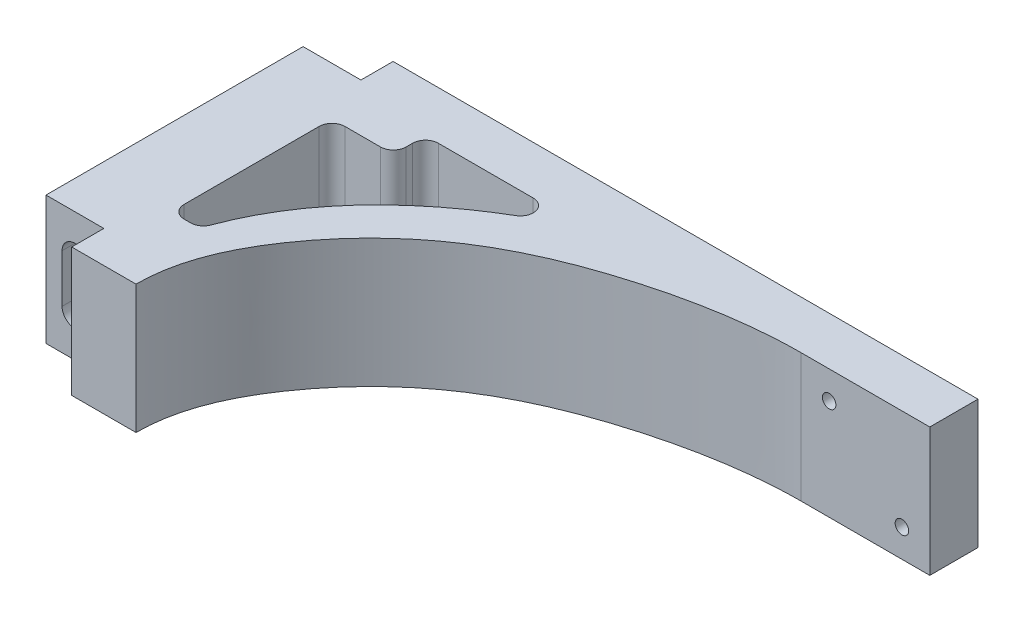
ISO-10303-21;
HEADER;
FILE_DESCRIPTION(('STEP AP214'),'2;1');
FILE_NAME('part.step','',(''),(''),'','','');
FILE_SCHEMA(('AUTOMOTIVE_DESIGN { 1 0 10303 214 1 1 1 1 }'));
ENDSEC;
DATA;
#1=APPLICATION_CONTEXT('core data for automotive mechanical design processes');
#2=APPLICATION_PROTOCOL_DEFINITION('international standard','automotive_design',2000,#1);
#3=PRODUCT_CONTEXT('',#1,'mechanical');
#4=PRODUCT('Part','Part','',(#3));
#5=PRODUCT_RELATED_PRODUCT_CATEGORY('part','',(#4));
#6=PRODUCT_DEFINITION_FORMATION('','',#4);
#7=PRODUCT_DEFINITION_CONTEXT('part definition',#1,'design');
#8=PRODUCT_DEFINITION('design','',#6,#7);
#9=PRODUCT_DEFINITION_SHAPE('','',#8);
#10=(LENGTH_UNIT() NAMED_UNIT(*) SI_UNIT(.MILLI.,.METRE.));
#11=(NAMED_UNIT(*) PLANE_ANGLE_UNIT() SI_UNIT($,.RADIAN.));
#12=(NAMED_UNIT(*) SI_UNIT($,.STERADIAN.) SOLID_ANGLE_UNIT());
#13=UNCERTAINTY_MEASURE_WITH_UNIT(LENGTH_MEASURE(1.E-05),#10,'distance_accuracy_value','');
#14=(GEOMETRIC_REPRESENTATION_CONTEXT(3) GLOBAL_UNCERTAINTY_ASSIGNED_CONTEXT((#13)) GLOBAL_UNIT_ASSIGNED_CONTEXT((#10,
#11,#12)) REPRESENTATION_CONTEXT('',''));
#15=CARTESIAN_POINT('',(0.,0.,0.));
#16=DIRECTION('',(0.,0.,1.));
#17=DIRECTION('',(1.,0.,0.));
#18=AXIS2_PLACEMENT_3D('',#15,#16,#17);
#19=CARTESIAN_POINT('',(12.5070357976708,20.,11.9830251142711));
#20=DIRECTION('',(0.,-1.,0.));
#21=DIRECTION('',(0.,0.,-1.));
#22=AXIS2_PLACEMENT_3D('',#19,#20,#21);
#23=PLANE('',#22);
#24=DIRECTION('',(-1.,0.,0.));
#25=VECTOR('',#24,1.);
#26=CARTESIAN_POINT('',(-28.6582563370952,20.,-0.746179815089038));
#27=LINE('',#26,#25);
#28=CARTESIAN_POINT('',(-19.6582563370952,20.,-0.746179815089023));
#29=VERTEX_POINT('',#28);
#30=CARTESIAN_POINT('',(-28.6582563370952,20.,-0.746179815089038));
#31=VERTEX_POINT('',#30);
#32=EDGE_CURVE('E349',#29,#31,#27,.T.);
#33=ORIENTED_EDGE('',*,*,#32,.T.);
#34=DIRECTION('',(0.,0.,1.));
#35=VECTOR('',#34,1.);
#36=CARTESIAN_POINT('',(-28.6582563370952,20.,-0.746179815089038));
#37=LINE('',#36,#35);
#38=CARTESIAN_POINT('',(-28.6582563370952,20.,39.253820184911));
#39=VERTEX_POINT('',#38);
#40=EDGE_CURVE('E395',#31,#39,#37,.T.);
#41=ORIENTED_EDGE('',*,*,#40,.T.);
#42=DIRECTION('',(1.,0.,0.));
#43=VECTOR('',#42,1.);
#44=CARTESIAN_POINT('',(-19.6582563370952,20.,39.253820184911));
#45=LINE('',#44,#43);
#46=CARTESIAN_POINT('',(-19.6582563370952,20.,39.253820184911));
#47=VERTEX_POINT('',#46);
#48=EDGE_CURVE('E379',#39,#47,#45,.T.);
#49=ORIENTED_EDGE('',*,*,#48,.T.);
#50=DIRECTION('',(0.,0.,1.));
#51=VECTOR('',#50,1.);
#52=CARTESIAN_POINT('',(-19.6582563370952,20.,44.253820184911));
#53=LINE('',#52,#51);
#54=CARTESIAN_POINT('',(-19.6582563370952,20.,44.253820184911));
#55=VERTEX_POINT('',#54);
#56=EDGE_CURVE('E394',#47,#55,#53,.T.);
#57=ORIENTED_EDGE('',*,*,#56,.T.);
#58=DIRECTION('',(1.,0.,0.));
#59=VECTOR('',#58,1.);
#60=CARTESIAN_POINT('',(-9.65825633709522,20.,44.253820184911));
#61=LINE('',#60,#59);
#62=CARTESIAN_POINT('',(-9.65825633709522,20.,44.253820184911));
#63=VERTEX_POINT('',#62);
#64=EDGE_CURVE('E309',#55,#63,#61,.T.);
#65=ORIENTED_EDGE('',*,*,#64,.T.);
#66=CARTESIAN_POINT('',(-9.65825633709522,20.,44.253820184911));
#67=CARTESIAN_POINT('',(-9.65825633709522,20.,37.8885028795573));
#68=CARTESIAN_POINT('',(-4.67583753182754,20.,26.6259134312278));
#69=CARTESIAN_POINT('',(9.29440035030482,20.,12.3276626777217));
#70=CARTESIAN_POINT('',(29.0667731762332,20.,4.28590793809066));
#71=CARTESIAN_POINT('',(43.9502207597576,20.,1.75382018491096));
#72=CARTESIAN_POINT('',(51.3417436629048,20.,1.75382018491096));
#73=B_SPLINE_CURVE_WITH_KNOTS('',3,(#66,#67,#68,#69,#70,#71,#72),.UNSPECIFIED.,.F.,.F.,(4,1,1,1,
4),(0.,0.219347647330992,0.451050169434159,0.721712385749768,1.),.UNSPECIFIED.);
#74=CARTESIAN_POINT('',(51.3417436629048,20.,1.75382018491096));
#75=VERTEX_POINT('',#74);
#76=EDGE_CURVE('E302',#63,#75,#73,.T.);
#77=ORIENTED_EDGE('',*,*,#76,.T.);
#78=DIRECTION('',(1.,0.,0.));
#79=VECTOR('',#78,1.);
#80=CARTESIAN_POINT('',(71.3417436629048,20.,1.75382018491096));
#81=LINE('',#80,#79);
#82=CARTESIAN_POINT('',(71.3417436629048,20.,1.75382018491096));
#83=VERTEX_POINT('',#82);
#84=EDGE_CURVE('E308',#75,#83,#81,.T.);
#85=ORIENTED_EDGE('',*,*,#84,.T.);
#86=DIRECTION('',(0.,0.,-1.));
#87=VECTOR('',#86,1.);
#88=CARTESIAN_POINT('',(71.3417436629048,20.,-5.74617981508904));
#89=LINE('',#88,#87);
#90=CARTESIAN_POINT('',(71.3417436629048,20.,-5.74617981508904));
#91=VERTEX_POINT('',#90);
#92=EDGE_CURVE('E315',#83,#91,#89,.T.);
#93=ORIENTED_EDGE('',*,*,#92,.T.);
#94=DIRECTION('',(-1.,0.,0.));
#95=VECTOR('',#94,1.);
#96=CARTESIAN_POINT('',(-19.6582563370952,20.,-5.74617981508902));
#97=LINE('',#96,#95);
#98=CARTESIAN_POINT('',(-19.6582563370952,20.,-5.74617981508902));
#99=VERTEX_POINT('',#98);
#100=EDGE_CURVE('E317',#91,#99,#97,.T.);
#101=ORIENTED_EDGE('',*,*,#100,.T.);
#102=DIRECTION('',(0.,0.,1.));
#103=VECTOR('',#102,1.);
#104=CARTESIAN_POINT('',(-19.6582563370952,20.,-0.746179815089023));
#105=LINE('',#104,#103);
#106=EDGE_CURVE('E319',#99,#29,#105,.T.);
#107=ORIENTED_EDGE('',*,*,#106,.T.);
#108=EDGE_LOOP('',(#33,#41,#49,#57,#65,#77,#85,#93,#101,#107));
#109=FACE_BOUND('',#108,.T.);
#110=CARTESIAN_POINT('',(-11.7837759860421,20.,30.451189107014));
#111=CARTESIAN_POINT('',(-11.2741851571584,20.,29.081443531117));
#112=CARTESIAN_POINT('',(-9.92430631581834,20.,25.9698878584016));
#113=CARTESIAN_POINT('',(-6.25265363904169,20.,19.752734333027));
#114=CARTESIAN_POINT('',(0.00114873176237278,20.,12.8231388491368));
#115=CARTESIAN_POINT('',(6.36706889389602,20.,8.07935758013021));
#116=CARTESIAN_POINT('',(10.0086539193125,20.,5.8603208288681));
#117=CARTESIAN_POINT('',(10.6588904455348,20.,5.47871409912117));
#118=B_SPLINE_CURVE_WITH_KNOTS('',3,(#110,#111,#112,#113,#114,#115,#116,#117),.UNSPECIFIED.,.F.,
.F.,(4,1,1,1,1,4),(0.457049826038681,0.498595933595701,0.553238181024709,0.662522675882725,
0.771807170740741,0.795346530072272),.UNSPECIFIED.);
#119=CARTESIAN_POINT('',(-11.7837759860421,20.,30.451189107014));
#120=VERTEX_POINT('',#119);
#121=CARTESIAN_POINT('',(10.6588904455348,20.,5.47871409912117));
#122=VERTEX_POINT('',#121);
#123=EDGE_CURVE('E253',#120,#122,#118,.T.);
#124=ORIENTED_EDGE('',*,*,#123,.F.);
#125=CARTESIAN_POINT('',(-13.6582563370952,20.,29.7538201849104));
#126=DIRECTION('',(0.,1.,0.));
#127=DIRECTION('',(0.,0.,1.));
#128=AXIS2_PLACEMENT_3D('',#125,#126,#127);
#129=CIRCLE('',#128,2.);
#130=CARTESIAN_POINT('',(-13.6582563370952,20.,31.7538201849104));
#131=VERTEX_POINT('',#130);
#132=EDGE_CURVE('E426',#131,#120,#129,.T.);
#133=ORIENTED_EDGE('',*,*,#132,.F.);
#134=DIRECTION('',(1.,0.,0.));
#135=VECTOR('',#134,1.);
#136=CARTESIAN_POINT('',(-13.6582563370952,20.,31.7538201849104));
#137=LINE('',#136,#135);
#138=CARTESIAN_POINT('',(-14.6582563370952,20.,31.7538201849104));
#139=VERTEX_POINT('',#138);
#140=EDGE_CURVE('E467',#139,#131,#137,.T.);
#141=ORIENTED_EDGE('',*,*,#140,.F.);
#142=CARTESIAN_POINT('',(-14.6582563370952,20.,29.7538201849104));
#143=DIRECTION('',(0.,1.,0.));
#144=DIRECTION('',(0.,0.,1.));
#145=AXIS2_PLACEMENT_3D('',#142,#143,#144);
#146=CIRCLE('',#145,2.);
#147=CARTESIAN_POINT('',(-16.6582563370952,20.,29.7538201849104));
#148=VERTEX_POINT('',#147);
#149=EDGE_CURVE('E470',#148,#139,#146,.T.);
#150=ORIENTED_EDGE('',*,*,#149,.F.);
#151=DIRECTION('',(0.,0.,1.));
#152=VECTOR('',#151,1.);
#153=CARTESIAN_POINT('',(-16.6582563370952,20.,8.75382018491086));
#154=LINE('',#153,#152);
#155=CARTESIAN_POINT('',(-16.6582563370952,20.,8.75382018491086));
#156=VERTEX_POINT('',#155);
#157=EDGE_CURVE('E472',#156,#148,#154,.T.);
#158=ORIENTED_EDGE('',*,*,#157,.F.);
#159=CARTESIAN_POINT('',(-14.6582563370952,20.,8.75382018491086));
#160=DIRECTION('',(0.,1.,0.));
#161=DIRECTION('',(0.,0.,-1.));
#162=AXIS2_PLACEMENT_3D('',#159,#160,#161);
#163=CIRCLE('',#162,2.);
#164=CARTESIAN_POINT('',(-14.6582563370952,20.,6.75382018491086));
#165=VERTEX_POINT('',#164);
#166=EDGE_CURVE('E474',#165,#156,#163,.T.);
#167=ORIENTED_EDGE('',*,*,#166,.F.);
#168=DIRECTION('',(-1.,0.,0.));
#169=VECTOR('',#168,1.);
#170=CARTESIAN_POINT('',(-14.6582563370952,20.,6.75382018491086));
#171=LINE('',#170,#169);
#172=CARTESIAN_POINT('',(-9.12056696530389,20.,6.75382018491086));
#173=VERTEX_POINT('',#172);
#174=EDGE_CURVE('E476',#173,#165,#171,.T.);
#175=ORIENTED_EDGE('',*,*,#174,.F.);
#176=CARTESIAN_POINT('',(-9.12056696530389,20.,4.75382018491086));
#177=DIRECTION('',(0.,-1.,0.));
#178=DIRECTION('',(0.,0.,-1.));
#179=AXIS2_PLACEMENT_3D('',#176,#177,#178);
#180=CIRCLE('',#179,2.);
#181=CARTESIAN_POINT('',(-7.12056696530389,20.,4.75382018491086));
#182=VERTEX_POINT('',#181);
#183=EDGE_CURVE('E478',#182,#173,#180,.T.);
#184=ORIENTED_EDGE('',*,*,#183,.F.);
#185=DIRECTION('',(0.,0.,1.));
#186=VECTOR('',#185,1.);
#187=CARTESIAN_POINT('',(-7.12056696530389,20.,4.75382018491086));
#188=LINE('',#187,#186);
#189=CARTESIAN_POINT('',(-7.12056696530389,20.,3.75382018491137));
#190=VERTEX_POINT('',#189);
#191=EDGE_CURVE('E480',#190,#182,#188,.T.);
#192=ORIENTED_EDGE('',*,*,#191,.F.);
#193=CARTESIAN_POINT('',(-5.12056696530389,20.,3.75382018491137));
#194=DIRECTION('',(0.,1.,0.));
#195=DIRECTION('',(0.,0.,-1.));
#196=AXIS2_PLACEMENT_3D('',#193,#194,#195);
#197=CIRCLE('',#196,2.);
#198=CARTESIAN_POINT('',(-5.12056696530389,20.,1.75382018491137));
#199=VERTEX_POINT('',#198);
#200=EDGE_CURVE('E482',#199,#190,#197,.T.);
#201=ORIENTED_EDGE('',*,*,#200,.F.);
#202=DIRECTION('',(-1.,0.,0.));
#203=VECTOR('',#202,1.);
#204=CARTESIAN_POINT('',(-5.12056696530389,20.,1.75382018491137));
#205=LINE('',#204,#203);
#206=CARTESIAN_POINT('',(9.64659553557918,20.,1.75382018491137));
#207=VERTEX_POINT('',#206);
#208=EDGE_CURVE('E483',#207,#199,#205,.T.);
#209=ORIENTED_EDGE('',*,*,#208,.F.);
#210=CARTESIAN_POINT('',(9.64659553557918,20.,3.75382018491137));
#211=DIRECTION('',(0.,1.,0.));
#212=DIRECTION('',(0.,0.,1.));
#213=AXIS2_PLACEMENT_3D('',#210,#211,#212);
#214=CIRCLE('',#213,2.);
#215=EDGE_CURVE('E258',#122,#207,#214,.T.);
#216=ORIENTED_EDGE('',*,*,#215,.F.);
#217=EDGE_LOOP('',(#124,#133,#141,#150,#158,#167,#175,#184,#192,#201,#209,#216));
#218=FACE_BOUND('',#217,.T.);
#219=ADVANCED_FACE('F37',(#109,#218),#23,.F.);
#220=CARTESIAN_POINT('',(12.5070357976708,0.,11.9830251142711));
#221=DIRECTION('',(0.,-1.,0.));
#222=DIRECTION('',(0.,0.,-1.));
#223=AXIS2_PLACEMENT_3D('',#220,#221,#222);
#224=PLANE('',#223);
#225=DIRECTION('',(-1.,0.,0.));
#226=VECTOR('',#225,1.);
#227=CARTESIAN_POINT('',(-28.6582563370952,0.,-0.746179815089038));
#228=LINE('',#227,#226);
#229=CARTESIAN_POINT('',(-19.6582563370952,0.,-0.746179815089023));
#230=VERTEX_POINT('',#229);
#231=CARTESIAN_POINT('',(-28.6582563370952,0.,-0.746179815089038));
#232=VERTEX_POINT('',#231);
#233=EDGE_CURVE('E322',#230,#232,#228,.T.);
#234=ORIENTED_EDGE('',*,*,#233,.F.);
#235=DIRECTION('',(0.,0.,1.));
#236=VECTOR('',#235,1.);
#237=CARTESIAN_POINT('',(-19.6582563370952,0.,-0.746179815089023));
#238=LINE('',#237,#236);
#239=CARTESIAN_POINT('',(-19.6582563370952,0.,-5.74617981508902));
#240=VERTEX_POINT('',#239);
#241=EDGE_CURVE('E347',#240,#230,#238,.T.);
#242=ORIENTED_EDGE('',*,*,#241,.F.);
#243=DIRECTION('',(-1.,0.,0.));
#244=VECTOR('',#243,1.);
#245=CARTESIAN_POINT('',(-19.6582563370952,0.,-5.74617981508902));
#246=LINE('',#245,#244);
#247=CARTESIAN_POINT('',(71.3417436629048,0.,-5.74617981508904));
#248=VERTEX_POINT('',#247);
#249=EDGE_CURVE('E345',#248,#240,#246,.T.);
#250=ORIENTED_EDGE('',*,*,#249,.F.);
#251=DIRECTION('',(0.,0.,-1.));
#252=VECTOR('',#251,1.);
#253=CARTESIAN_POINT('',(71.3417436629048,0.,-5.74617981508904));
#254=LINE('',#253,#252);
#255=CARTESIAN_POINT('',(71.3417436629048,0.,1.75382018491096));
#256=VERTEX_POINT('',#255);
#257=EDGE_CURVE('E343',#256,#248,#254,.T.);
#258=ORIENTED_EDGE('',*,*,#257,.F.);
#259=DIRECTION('',(1.,0.,0.));
#260=VECTOR('',#259,1.);
#261=CARTESIAN_POINT('',(71.3417436629048,0.,1.75382018491096));
#262=LINE('',#261,#260);
#263=CARTESIAN_POINT('',(51.3417436629048,0.,1.75382018491096));
#264=VERTEX_POINT('',#263);
#265=EDGE_CURVE('E338',#264,#256,#262,.T.);
#266=ORIENTED_EDGE('',*,*,#265,.F.);
#267=CARTESIAN_POINT('',(-9.65825633709522,0.,44.253820184911));
#268=CARTESIAN_POINT('',(-9.65825633709522,0.,37.8885028795573));
#269=CARTESIAN_POINT('',(-4.67583753182754,0.,26.6259134312278));
#270=CARTESIAN_POINT('',(9.29440035030482,0.,12.3276626777217));
#271=CARTESIAN_POINT('',(29.0667731762332,0.,4.28590793809066));
#272=CARTESIAN_POINT('',(43.9502207597576,0.,1.75382018491096));
#273=CARTESIAN_POINT('',(51.3417436629048,0.,1.75382018491096));
#274=B_SPLINE_CURVE_WITH_KNOTS('',3,(#267,#268,#269,#270,#271,#272,#273),.UNSPECIFIED.,.F.,.F.,
(4,1,1,1,4),(0.,0.219347647330992,0.451050169434159,0.721712385749768,1.),.UNSPECIFIED.);
#275=CARTESIAN_POINT('',(-9.65825633709522,0.,44.253820184911));
#276=VERTEX_POINT('',#275);
#277=EDGE_CURVE('E334',#276,#264,#274,.T.);
#278=ORIENTED_EDGE('',*,*,#277,.F.);
#279=DIRECTION('',(1.,0.,0.));
#280=VECTOR('',#279,1.);
#281=CARTESIAN_POINT('',(-9.65825633709522,0.,44.253820184911));
#282=LINE('',#281,#280);
#283=CARTESIAN_POINT('',(-19.6582563370952,0.,44.253820184911));
#284=VERTEX_POINT('',#283);
#285=EDGE_CURVE('E332',#284,#276,#282,.T.);
#286=ORIENTED_EDGE('',*,*,#285,.F.);
#287=DIRECTION('',(0.,0.,1.));
#288=VECTOR('',#287,1.);
#289=CARTESIAN_POINT('',(-19.6582563370952,0.,44.253820184911));
#290=LINE('',#289,#288);
#291=CARTESIAN_POINT('',(-19.6582563370952,0.,39.253820184911));
#292=VERTEX_POINT('',#291);
#293=EDGE_CURVE('E330',#292,#284,#290,.T.);
#294=ORIENTED_EDGE('',*,*,#293,.F.);
#295=DIRECTION('',(1.,0.,0.));
#296=VECTOR('',#295,1.);
#297=CARTESIAN_POINT('',(-19.6582563370952,0.,39.253820184911));
#298=LINE('',#297,#296);
#299=CARTESIAN_POINT('',(-28.6582563370952,0.,39.253820184911));
#300=VERTEX_POINT('',#299);
#301=EDGE_CURVE('E328',#300,#292,#298,.T.);
#302=ORIENTED_EDGE('',*,*,#301,.F.);
#303=DIRECTION('',(0.,0.,1.));
#304=VECTOR('',#303,1.);
#305=CARTESIAN_POINT('',(-28.6582563370952,0.,-0.746179815089038));
#306=LINE('',#305,#304);
#307=EDGE_CURVE('E325',#232,#300,#306,.T.);
#308=ORIENTED_EDGE('',*,*,#307,.F.);
#309=EDGE_LOOP('',(#234,#242,#250,#258,#266,#278,#286,#294,#302,#308));
#310=FACE_BOUND('',#309,.T.);
#311=CARTESIAN_POINT('',(-13.6582563370952,0.,29.7538201849104));
#312=DIRECTION('',(0.,1.,0.));
#313=DIRECTION('',(0.,0.,1.));
#314=AXIS2_PLACEMENT_3D('',#311,#312,#313);
#315=CIRCLE('',#314,2.);
#316=CARTESIAN_POINT('',(-13.6582563370952,0.,31.7538201849104));
#317=VERTEX_POINT('',#316);
#318=CARTESIAN_POINT('',(-11.7837759860421,0.,30.451189107014));
#319=VERTEX_POINT('',#318);
#320=EDGE_CURVE('E259',#317,#319,#315,.T.);
#321=ORIENTED_EDGE('',*,*,#320,.T.);
#322=CARTESIAN_POINT('',(-11.7837759860421,0.,30.451189107014));
#323=CARTESIAN_POINT('',(-11.2741851571584,0.,29.081443531117));
#324=CARTESIAN_POINT('',(-9.92430631581834,0.,25.9698878584016));
#325=CARTESIAN_POINT('',(-6.25265363904169,0.,19.752734333027));
#326=CARTESIAN_POINT('',(0.00114873176237278,0.,12.8231388491368));
#327=CARTESIAN_POINT('',(6.36706889389602,0.,8.07935758013021));
#328=CARTESIAN_POINT('',(10.0086539193125,0.,5.8603208288681));
#329=CARTESIAN_POINT('',(10.6588904455348,0.,5.47871409912117));
#330=B_SPLINE_CURVE_WITH_KNOTS('',3,(#322,#323,#324,#325,#326,#327,#328,#329),.UNSPECIFIED.,.F.,
.F.,(4,1,1,1,1,4),(0.457049826038681,0.498595933595701,0.553238181024709,0.662522675882725,
0.771807170740741,0.795346530072272),.UNSPECIFIED.);
#331=CARTESIAN_POINT('',(10.6588904455348,0.,5.47871409912117));
#332=VERTEX_POINT('',#331);
#333=EDGE_CURVE('E252',#319,#332,#330,.T.);
#334=ORIENTED_EDGE('',*,*,#333,.T.);
#335=CARTESIAN_POINT('',(9.64659553557918,0.,3.75382018491137));
#336=DIRECTION('',(0.,1.,0.));
#337=DIRECTION('',(0.,0.,1.));
#338=AXIS2_PLACEMENT_3D('',#335,#336,#337);
#339=CIRCLE('',#338,2.);
#340=CARTESIAN_POINT('',(9.64659553557918,0.,1.75382018491137));
#341=VERTEX_POINT('',#340);
#342=EDGE_CURVE('E456',#332,#341,#339,.T.);
#343=ORIENTED_EDGE('',*,*,#342,.T.);
#344=DIRECTION('',(-1.,0.,0.));
#345=VECTOR('',#344,1.);
#346=CARTESIAN_POINT('',(-5.12056696530389,0.,1.75382018491137));
#347=LINE('',#346,#345);
#348=CARTESIAN_POINT('',(-5.12056696530389,0.,1.75382018491137));
#349=VERTEX_POINT('',#348);
#350=EDGE_CURVE('E453',#341,#349,#347,.T.);
#351=ORIENTED_EDGE('',*,*,#350,.T.);
#352=CARTESIAN_POINT('',(-5.12056696530389,0.,3.75382018491137));
#353=DIRECTION('',(0.,1.,0.));
#354=DIRECTION('',(0.,0.,-1.));
#355=AXIS2_PLACEMENT_3D('',#352,#353,#354);
#356=CIRCLE('',#355,2.);
#357=CARTESIAN_POINT('',(-7.12056696530389,0.,3.75382018491137));
#358=VERTEX_POINT('',#357);
#359=EDGE_CURVE('E450',#349,#358,#356,.T.);
#360=ORIENTED_EDGE('',*,*,#359,.T.);
#361=DIRECTION('',(0.,0.,1.));
#362=VECTOR('',#361,1.);
#363=CARTESIAN_POINT('',(-7.12056696530389,0.,4.75382018491086));
#364=LINE('',#363,#362);
#365=CARTESIAN_POINT('',(-7.12056696530389,0.,4.75382018491086));
#366=VERTEX_POINT('',#365);
#367=EDGE_CURVE('E447',#358,#366,#364,.T.);
#368=ORIENTED_EDGE('',*,*,#367,.T.);
#369=CARTESIAN_POINT('',(-9.12056696530389,0.,4.75382018491086));
#370=DIRECTION('',(0.,-1.,0.));
#371=DIRECTION('',(0.,0.,-1.));
#372=AXIS2_PLACEMENT_3D('',#369,#370,#371);
#373=CIRCLE('',#372,2.);
#374=CARTESIAN_POINT('',(-9.12056696530389,0.,6.75382018491086));
#375=VERTEX_POINT('',#374);
#376=EDGE_CURVE('E444',#366,#375,#373,.T.);
#377=ORIENTED_EDGE('',*,*,#376,.T.);
#378=DIRECTION('',(-1.,0.,0.));
#379=VECTOR('',#378,1.);
#380=CARTESIAN_POINT('',(-14.6582563370952,0.,6.75382018491086));
#381=LINE('',#380,#379);
#382=CARTESIAN_POINT('',(-14.6582563370952,0.,6.75382018491086));
#383=VERTEX_POINT('',#382);
#384=EDGE_CURVE('E441',#375,#383,#381,.T.);
#385=ORIENTED_EDGE('',*,*,#384,.T.);
#386=CARTESIAN_POINT('',(-14.6582563370952,0.,8.75382018491086));
#387=DIRECTION('',(0.,1.,0.));
#388=DIRECTION('',(0.,0.,-1.));
#389=AXIS2_PLACEMENT_3D('',#386,#387,#388);
#390=CIRCLE('',#389,2.);
#391=CARTESIAN_POINT('',(-16.6582563370952,0.,8.75382018491086));
#392=VERTEX_POINT('',#391);
#393=EDGE_CURVE('E438',#383,#392,#390,.T.);
#394=ORIENTED_EDGE('',*,*,#393,.T.);
#395=DIRECTION('',(0.,0.,1.));
#396=VECTOR('',#395,1.);
#397=CARTESIAN_POINT('',(-16.6582563370952,0.,8.75382018491086));
#398=LINE('',#397,#396);
#399=CARTESIAN_POINT('',(-16.6582563370952,0.,29.7538201849104));
#400=VERTEX_POINT('',#399);
#401=EDGE_CURVE('E435',#392,#400,#398,.T.);
#402=ORIENTED_EDGE('',*,*,#401,.T.);
#403=CARTESIAN_POINT('',(-14.6582563370952,0.,29.7538201849104));
#404=DIRECTION('',(0.,1.,0.));
#405=DIRECTION('',(0.,0.,1.));
#406=AXIS2_PLACEMENT_3D('',#403,#404,#405);
#407=CIRCLE('',#406,2.);
#408=CARTESIAN_POINT('',(-14.6582563370952,0.,31.7538201849104));
#409=VERTEX_POINT('',#408);
#410=EDGE_CURVE('E432',#400,#409,#407,.T.);
#411=ORIENTED_EDGE('',*,*,#410,.T.);
#412=DIRECTION('',(1.,0.,0.));
#413=VECTOR('',#412,1.);
#414=CARTESIAN_POINT('',(-13.6582563370952,0.,31.7538201849104));
#415=LINE('',#414,#413);
#416=EDGE_CURVE('E429',#409,#317,#415,.T.);
#417=ORIENTED_EDGE('',*,*,#416,.T.);
#418=EDGE_LOOP('',(#321,#334,#343,#351,#360,#368,#377,#385,#394,#402,#411,#417));
#419=FACE_BOUND('',#418,.T.);
#420=ADVANCED_FACE('F275',(#310,#419),#224,.T.);
#421=CARTESIAN_POINT('',(-28.6582563370952,20.,-0.746179815089038));
#422=DIRECTION('',(0.,0.,1.));
#423=DIRECTION('',(1.,0.,0.));
#424=AXIS2_PLACEMENT_3D('',#421,#422,#423);
#425=PLANE('',#424);
#426=DIRECTION('',(0.,1.,0.));
#427=VECTOR('',#426,1.);
#428=CARTESIAN_POINT('',(-26.1582563370952,6.25,-0.746179815088991));
#429=LINE('',#428,#427);
#430=CARTESIAN_POINT('',(-26.1582563370952,6.25,-0.746179815089033));
#431=VERTEX_POINT('',#430);
#432=CARTESIAN_POINT('',(-26.1582563370952,13.75,-0.746179815088991));
#433=VERTEX_POINT('',#432);
#434=EDGE_CURVE('E222',#431,#433,#429,.T.);
#435=ORIENTED_EDGE('',*,*,#434,.F.);
#436=CARTESIAN_POINT('',(-24.1582563370952,6.25,-0.746179815088991));
#437=DIRECTION('',(0.,0.,-1.));
#438=DIRECTION('',(-1.,0.,0.));
#439=AXIS2_PLACEMENT_3D('',#436,#437,#438);
#440=CIRCLE('',#439,2.);
#441=CARTESIAN_POINT('',(-22.1582563370952,6.25,-0.746179815088991));
#442=VERTEX_POINT('',#441);
#443=EDGE_CURVE('E52',#442,#431,#440,.T.);
#444=ORIENTED_EDGE('',*,*,#443,.F.);
#445=DIRECTION('',(0.,1.,0.));
#446=VECTOR('',#445,1.);
#447=CARTESIAN_POINT('',(-22.1582563370952,6.25,-0.746179815088991));
#448=LINE('',#447,#446);
#449=CARTESIAN_POINT('',(-22.1582563370952,13.75,-0.746179815088991));
#450=VERTEX_POINT('',#449);
#451=EDGE_CURVE('E228',#442,#450,#448,.T.);
#452=ORIENTED_EDGE('',*,*,#451,.T.);
#453=CARTESIAN_POINT('',(-24.1582563370952,13.75,-0.746179815088991));
#454=DIRECTION('',(0.,0.,-1.));
#455=DIRECTION('',(-1.,0.,0.));
#456=AXIS2_PLACEMENT_3D('',#453,#454,#455);
#457=CIRCLE('',#456,2.);
#458=EDGE_CURVE('E213',#433,#450,#457,.T.);
#459=ORIENTED_EDGE('',*,*,#458,.F.);
#460=EDGE_LOOP('',(#435,#444,#452,#459));
#461=FACE_BOUND('',#460,.T.);
#462=ORIENTED_EDGE('',*,*,#233,.T.);
#463=DIRECTION('',(0.,-1.,0.));
#464=VECTOR('',#463,1.);
#465=CARTESIAN_POINT('',(-28.6582563370952,20.,-0.746179815089038));
#466=LINE('',#465,#464);
#467=EDGE_CURVE('E11',#31,#232,#466,.T.);
#468=ORIENTED_EDGE('',*,*,#467,.F.);
#469=ORIENTED_EDGE('',*,*,#32,.F.);
#470=DIRECTION('',(0.,-1.,0.));
#471=VECTOR('',#470,1.);
#472=CARTESIAN_POINT('',(-19.6582563370952,20.,-0.746179815089023));
#473=LINE('',#472,#471);
#474=EDGE_CURVE('E321',#29,#230,#473,.T.);
#475=ORIENTED_EDGE('',*,*,#474,.T.);
#476=EDGE_LOOP('',(#462,#468,#469,#475));
#477=FACE_BOUND('',#476,.T.);
#478=ADVANCED_FACE('F39',(#461,#477),#425,.F.);
#479=CARTESIAN_POINT('',(-28.6582563370952,20.,-0.746179815089038));
#480=DIRECTION('',(1.,0.,0.));
#481=DIRECTION('',(0.,0.,-1.));
#482=AXIS2_PLACEMENT_3D('',#479,#480,#481);
#483=PLANE('',#482);
#484=ORIENTED_EDGE('',*,*,#307,.T.);
#485=DIRECTION('',(0.,-1.,0.));
#486=VECTOR('',#485,1.);
#487=CARTESIAN_POINT('',(-28.6582563370952,20.,39.253820184911));
#488=LINE('',#487,#486);
#489=EDGE_CURVE('E45',#39,#300,#488,.T.);
#490=ORIENTED_EDGE('',*,*,#489,.F.);
#491=ORIENTED_EDGE('',*,*,#40,.F.);
#492=ORIENTED_EDGE('',*,*,#467,.T.);
#493=EDGE_LOOP('',(#484,#490,#491,#492));
#494=FACE_BOUND('',#493,.T.);
#495=ADVANCED_FACE('F599',(#494),#483,.F.);
#496=CARTESIAN_POINT('',(-19.6582563370952,20.,39.253820184911));
#497=DIRECTION('',(0.,0.,-1.));
#498=DIRECTION('',(-1.,0.,0.));
#499=AXIS2_PLACEMENT_3D('',#496,#497,#498);
#500=PLANE('',#499);
#501=DIRECTION('',(0.,-1.,0.));
#502=VECTOR('',#501,1.);
#503=CARTESIAN_POINT('',(-22.1582563370952,6.25,39.253820184911));
#504=LINE('',#503,#502);
#505=CARTESIAN_POINT('',(-22.1582563370952,13.75,39.253820184911));
#506=VERTEX_POINT('',#505);
#507=CARTESIAN_POINT('',(-22.1582563370952,6.25,39.253820184911));
#508=VERTEX_POINT('',#507);
#509=EDGE_CURVE('E766',#506,#508,#504,.T.);
#510=ORIENTED_EDGE('',*,*,#509,.T.);
#511=CARTESIAN_POINT('',(-24.1582563370952,6.25,39.253820184911));
#512=DIRECTION('',(0.,0.,-1.));
#513=DIRECTION('',(-1.,0.,0.));
#514=AXIS2_PLACEMENT_3D('',#511,#512,#513);
#515=CIRCLE('',#514,2.);
#516=CARTESIAN_POINT('',(-26.1582563370952,6.25,39.253820184911));
#517=VERTEX_POINT('',#516);
#518=EDGE_CURVE('E240',#517,#508,#515,.F.);
#519=ORIENTED_EDGE('',*,*,#518,.F.);
#520=DIRECTION('',(0.,-1.,0.));
#521=VECTOR('',#520,1.);
#522=CARTESIAN_POINT('',(-26.1582563370952,6.25,39.253820184911));
#523=LINE('',#522,#521);
#524=CARTESIAN_POINT('',(-26.1582563370952,13.75,39.253820184911));
#525=VERTEX_POINT('',#524);
#526=EDGE_CURVE('E237',#525,#517,#523,.T.);
#527=ORIENTED_EDGE('',*,*,#526,.F.);
#528=CARTESIAN_POINT('',(-24.1582563370952,13.75,39.253820184911));
#529=DIRECTION('',(0.,0.,-1.));
#530=DIRECTION('',(-1.,0.,0.));
#531=AXIS2_PLACEMENT_3D('',#528,#529,#530);
#532=CIRCLE('',#531,2.);
#533=EDGE_CURVE('E216',#506,#525,#532,.F.);
#534=ORIENTED_EDGE('',*,*,#533,.F.);
#535=EDGE_LOOP('',(#510,#519,#527,#534));
#536=FACE_BOUND('',#535,.T.);
#537=ORIENTED_EDGE('',*,*,#301,.T.);
#538=DIRECTION('',(0.,-1.,0.));
#539=VECTOR('',#538,1.);
#540=CARTESIAN_POINT('',(-19.6582563370952,20.,39.253820184911));
#541=LINE('',#540,#539);
#542=EDGE_CURVE('E370',#47,#292,#541,.T.);
#543=ORIENTED_EDGE('',*,*,#542,.F.);
#544=ORIENTED_EDGE('',*,*,#48,.F.);
#545=ORIENTED_EDGE('',*,*,#489,.T.);
#546=EDGE_LOOP('',(#537,#543,#544,#545));
#547=FACE_BOUND('',#546,.T.);
#548=ADVANCED_FACE('F377',(#536,#547),#500,.F.);
#549=CARTESIAN_POINT('',(-19.6582563370952,20.,44.253820184911));
#550=DIRECTION('',(1.,0.,0.));
#551=DIRECTION('',(0.,0.,-1.));
#552=AXIS2_PLACEMENT_3D('',#549,#550,#551);
#553=PLANE('',#552);
#554=ORIENTED_EDGE('',*,*,#293,.T.);
#555=DIRECTION('',(0.,-1.,0.));
#556=VECTOR('',#555,1.);
#557=CARTESIAN_POINT('',(-19.6582563370952,20.,44.253820184911));
#558=LINE('',#557,#556);
#559=EDGE_CURVE('E367',#55,#284,#558,.T.);
#560=ORIENTED_EDGE('',*,*,#559,.F.);
#561=ORIENTED_EDGE('',*,*,#56,.F.);
#562=ORIENTED_EDGE('',*,*,#542,.T.);
#563=EDGE_LOOP('',(#554,#560,#561,#562));
#564=FACE_BOUND('',#563,.T.);
#565=ADVANCED_FACE('F388',(#564),#553,.F.);
#566=CARTESIAN_POINT('',(-9.65825633709522,20.,44.253820184911));
#567=DIRECTION('',(0.,0.,-1.));
#568=DIRECTION('',(-1.,0.,0.));
#569=AXIS2_PLACEMENT_3D('',#566,#567,#568);
#570=PLANE('',#569);
#571=ORIENTED_EDGE('',*,*,#285,.T.);
#572=DIRECTION('',(0.,-1.,0.));
#573=VECTOR('',#572,1.);
#574=CARTESIAN_POINT('',(-9.65825633709522,20.,44.253820184911));
#575=LINE('',#574,#573);
#576=EDGE_CURVE('E364',#63,#276,#575,.T.);
#577=ORIENTED_EDGE('',*,*,#576,.F.);
#578=ORIENTED_EDGE('',*,*,#64,.F.);
#579=ORIENTED_EDGE('',*,*,#559,.T.);
#580=EDGE_LOOP('',(#571,#577,#578,#579));
#581=FACE_BOUND('',#580,.T.);
#582=ADVANCED_FACE('F299',(#581),#570,.F.);
#583=DIRECTION('',(0.,-1.,0.));
#584=VECTOR('',#583,1.);
#585=SURFACE_OF_LINEAR_EXTRUSION('',#73,#584);
#586=ORIENTED_EDGE('',*,*,#277,.T.);
#587=DIRECTION('',(0.,-1.,0.));
#588=VECTOR('',#587,1.);
#589=CARTESIAN_POINT('',(51.3417436629048,20.,1.75382018491096));
#590=LINE('',#589,#588);
#591=EDGE_CURVE('E361',#75,#264,#590,.T.);
#592=ORIENTED_EDGE('',*,*,#591,.F.);
#593=ORIENTED_EDGE('',*,*,#76,.F.);
#594=ORIENTED_EDGE('',*,*,#576,.T.);
#595=EDGE_LOOP('',(#586,#592,#593,#594));
#596=FACE_BOUND('',#595,.T.);
#597=ADVANCED_FACE('F294',(#596),#585,.F.);
#598=CARTESIAN_POINT('',(71.3417436629048,20.,1.75382018491096));
#599=DIRECTION('',(0.,0.,-1.));
#600=DIRECTION('',(-1.,0.,0.));
#601=AXIS2_PLACEMENT_3D('',#598,#599,#600);
#602=PLANE('',#601);
#603=CARTESIAN_POINT('',(55.6848894134124,15.6568542494923,1.75382018491096));
#604=DIRECTION('',(0.,0.,-1.));
#605=DIRECTION('',(-1.,0.,0.));
#606=AXIS2_PLACEMENT_3D('',#603,#604,#605);
#607=CIRCLE('',#606,1.05000000000001);
#608=CARTESIAN_POINT('',(54.6348894134124,15.6568542494923,1.75382018491096));
#609=VERTEX_POINT('',#608);
#610=EDGE_CURVE('E249',#609,#609,#607,.T.);
#611=ORIENTED_EDGE('',*,*,#610,.T.);
#612=EDGE_LOOP('',(#611));
#613=FACE_BOUND('',#612,.T.);
#614=CARTESIAN_POINT('',(66.9985979123972,4.34314575050765,1.75382018491096));
#615=DIRECTION('',(0.,0.,-1.));
#616=DIRECTION('',(-1.,0.,0.));
#617=AXIS2_PLACEMENT_3D('',#614,#615,#616);
#618=CIRCLE('',#617,1.04999999999999);
#619=CARTESIAN_POINT('',(65.9485979123972,4.34314575050765,1.75382018491096));
#620=VERTEX_POINT('',#619);
#621=EDGE_CURVE('E244',#620,#620,#618,.T.);
#622=ORIENTED_EDGE('',*,*,#621,.T.);
#623=EDGE_LOOP('',(#622));
#624=FACE_BOUND('',#623,.T.);
#625=ORIENTED_EDGE('',*,*,#265,.T.);
#626=DIRECTION('',(0.,-1.,0.));
#627=VECTOR('',#626,1.);
#628=CARTESIAN_POINT('',(71.3417436629048,20.,1.75382018491096));
#629=LINE('',#628,#627);
#630=EDGE_CURVE('E358',#83,#256,#629,.T.);
#631=ORIENTED_EDGE('',*,*,#630,.F.);
#632=ORIENTED_EDGE('',*,*,#84,.F.);
#633=ORIENTED_EDGE('',*,*,#591,.T.);
#634=EDGE_LOOP('',(#625,#631,#632,#633));
#635=FACE_BOUND('',#634,.T.);
#636=ADVANCED_FACE('F290',(#613,#624,#635),#602,.F.);
#637=CARTESIAN_POINT('',(71.3417436629048,20.,-5.74617981508904));
#638=DIRECTION('',(-1.,0.,0.));
#639=DIRECTION('',(0.,0.,1.));
#640=AXIS2_PLACEMENT_3D('',#637,#638,#639);
#641=PLANE('',#640);
#642=ORIENTED_EDGE('',*,*,#257,.T.);
#643=DIRECTION('',(0.,-1.,0.));
#644=VECTOR('',#643,1.);
#645=CARTESIAN_POINT('',(71.3417436629048,20.,-5.74617981508904));
#646=LINE('',#645,#644);
#647=EDGE_CURVE('E355',#91,#248,#646,.T.);
#648=ORIENTED_EDGE('',*,*,#647,.F.);
#649=ORIENTED_EDGE('',*,*,#92,.F.);
#650=ORIENTED_EDGE('',*,*,#630,.T.);
#651=EDGE_LOOP('',(#642,#648,#649,#650));
#652=FACE_BOUND('',#651,.T.);
#653=ADVANCED_FACE('F286',(#652),#641,.F.);
#654=CARTESIAN_POINT('',(-19.6582563370952,20.,-5.74617981508902));
#655=DIRECTION('',(0.,0.,1.));
#656=DIRECTION('',(1.,0.,0.));
#657=AXIS2_PLACEMENT_3D('',#654,#655,#656);
#658=PLANE('',#657);
#659=CARTESIAN_POINT('',(55.6848894134124,15.6568542494923,-5.74617981508903));
#660=DIRECTION('',(0.,0.,-1.));
#661=DIRECTION('',(-1.,0.,0.));
#662=AXIS2_PLACEMENT_3D('',#659,#660,#661);
#663=CIRCLE('',#662,1.05000000000001);
#664=CARTESIAN_POINT('',(54.6348894134124,15.6568542494923,-5.74617981508903));
#665=VERTEX_POINT('',#664);
#666=EDGE_CURVE('E241',#665,#665,#663,.T.);
#667=ORIENTED_EDGE('',*,*,#666,.F.);
#668=EDGE_LOOP('',(#667));
#669=FACE_BOUND('',#668,.T.);
#670=CARTESIAN_POINT('',(66.9985979123972,4.34314575050765,-5.74617981508903));
#671=DIRECTION('',(0.,0.,-1.));
#672=DIRECTION('',(-1.,0.,0.));
#673=AXIS2_PLACEMENT_3D('',#670,#671,#672);
#674=CIRCLE('',#673,1.04999999999999);
#675=CARTESIAN_POINT('',(65.9485979123972,4.34314575050765,-5.74617981508903));
#676=VERTEX_POINT('',#675);
#677=EDGE_CURVE('E239',#676,#676,#674,.T.);
#678=ORIENTED_EDGE('',*,*,#677,.F.);
#679=EDGE_LOOP('',(#678));
#680=FACE_BOUND('',#679,.T.);
#681=ORIENTED_EDGE('',*,*,#249,.T.);
#682=DIRECTION('',(0.,-1.,0.));
#683=VECTOR('',#682,1.);
#684=CARTESIAN_POINT('',(-19.6582563370952,20.,-5.74617981508902));
#685=LINE('',#684,#683);
#686=EDGE_CURVE('E352',#99,#240,#685,.T.);
#687=ORIENTED_EDGE('',*,*,#686,.F.);
#688=ORIENTED_EDGE('',*,*,#100,.F.);
#689=ORIENTED_EDGE('',*,*,#647,.T.);
#690=EDGE_LOOP('',(#681,#687,#688,#689));
#691=FACE_BOUND('',#690,.T.);
#692=ADVANCED_FACE('F282',(#669,#680,#691),#658,.F.);
#693=CARTESIAN_POINT('',(-19.6582563370952,20.,-0.746179815089023));
#694=DIRECTION('',(1.,0.,0.));
#695=DIRECTION('',(0.,0.,-1.));
#696=AXIS2_PLACEMENT_3D('',#693,#694,#695);
#697=PLANE('',#696);
#698=ORIENTED_EDGE('',*,*,#241,.T.);
#699=ORIENTED_EDGE('',*,*,#474,.F.);
#700=ORIENTED_EDGE('',*,*,#106,.F.);
#701=ORIENTED_EDGE('',*,*,#686,.T.);
#702=EDGE_LOOP('',(#698,#699,#700,#701));
#703=FACE_BOUND('',#702,.T.);
#704=ADVANCED_FACE('F270',(#703),#697,.F.);
#705=DIRECTION('',(0.,-1.,0.));
#706=VECTOR('',#705,1.);
#707=SURFACE_OF_LINEAR_EXTRUSION('',#118,#706);
#708=ORIENTED_EDGE('',*,*,#333,.F.);
#709=DIRECTION('',(0.,-1.,0.));
#710=VECTOR('',#709,1.);
#711=CARTESIAN_POINT('',(-11.7837759860421,20.,30.451189107014));
#712=LINE('',#711,#710);
#713=EDGE_CURVE('E423',#120,#319,#712,.T.);
#714=ORIENTED_EDGE('',*,*,#713,.F.);
#715=ORIENTED_EDGE('',*,*,#123,.T.);
#716=DIRECTION('',(0.,-1.,0.));
#717=VECTOR('',#716,1.);
#718=CARTESIAN_POINT('',(10.6588904455348,20.,5.47871409912117));
#719=LINE('',#718,#717);
#720=EDGE_CURVE('E326',#122,#332,#719,.T.);
#721=ORIENTED_EDGE('',*,*,#720,.T.);
#722=EDGE_LOOP('',(#708,#714,#715,#721));
#723=FACE_BOUND('',#722,.T.);
#724=ADVANCED_FACE('F265',(#723),#707,.T.);
#725=CARTESIAN_POINT('',(9.64659553557918,20.,3.75382018491137));
#726=DIRECTION('',(0.,-1.,0.));
#727=DIRECTION('',(0.,0.,-1.));
#728=AXIS2_PLACEMENT_3D('',#725,#726,#727);
#729=CYLINDRICAL_SURFACE('',#728,2.);
#730=ORIENTED_EDGE('',*,*,#342,.F.);
#731=ORIENTED_EDGE('',*,*,#720,.F.);
#732=ORIENTED_EDGE('',*,*,#215,.T.);
#733=DIRECTION('',(0.,-1.,0.));
#734=VECTOR('',#733,1.);
#735=CARTESIAN_POINT('',(9.64659553557918,20.,1.75382018491137));
#736=LINE('',#735,#734);
#737=EDGE_CURVE('E403',#207,#341,#736,.T.);
#738=ORIENTED_EDGE('',*,*,#737,.T.);
#739=EDGE_LOOP('',(#730,#731,#732,#738));
#740=FACE_BOUND('',#739,.T.);
#741=ADVANCED_FACE('F269',(#740),#729,.F.);
#742=CARTESIAN_POINT('',(-5.12056696530389,20.,1.75382018491137));
#743=DIRECTION('',(0.,0.,1.));
#744=DIRECTION('',(1.,0.,0.));
#745=AXIS2_PLACEMENT_3D('',#742,#743,#744);
#746=PLANE('',#745);
#747=ORIENTED_EDGE('',*,*,#350,.F.);
#748=ORIENTED_EDGE('',*,*,#737,.F.);
#749=ORIENTED_EDGE('',*,*,#208,.T.);
#750=DIRECTION('',(0.,-1.,0.));
#751=VECTOR('',#750,1.);
#752=CARTESIAN_POINT('',(-5.12056696530389,20.,1.75382018491137));
#753=LINE('',#752,#751);
#754=EDGE_CURVE('E405',#199,#349,#753,.T.);
#755=ORIENTED_EDGE('',*,*,#754,.T.);
#756=EDGE_LOOP('',(#747,#748,#749,#755));
#757=FACE_BOUND('',#756,.T.);
#758=ADVANCED_FACE('F494',(#757),#746,.T.);
#759=CARTESIAN_POINT('',(-5.12056696530389,20.,3.75382018491137));
#760=DIRECTION('',(0.,-1.,0.));
#761=DIRECTION('',(0.,0.,-1.));
#762=AXIS2_PLACEMENT_3D('',#759,#760,#761);
#763=CYLINDRICAL_SURFACE('',#762,2.);
#764=ORIENTED_EDGE('',*,*,#359,.F.);
#765=ORIENTED_EDGE('',*,*,#754,.F.);
#766=ORIENTED_EDGE('',*,*,#200,.T.);
#767=DIRECTION('',(0.,-1.,0.));
#768=VECTOR('',#767,1.);
#769=CARTESIAN_POINT('',(-7.12056696530389,20.,3.75382018491137));
#770=LINE('',#769,#768);
#771=EDGE_CURVE('E407',#190,#358,#770,.T.);
#772=ORIENTED_EDGE('',*,*,#771,.T.);
#773=EDGE_LOOP('',(#764,#765,#766,#772));
#774=FACE_BOUND('',#773,.T.);
#775=ADVANCED_FACE('F501',(#774),#763,.F.);
#776=CARTESIAN_POINT('',(-7.12056696530389,20.,4.75382018491086));
#777=DIRECTION('',(1.,0.,0.));
#778=DIRECTION('',(0.,0.,-1.));
#779=AXIS2_PLACEMENT_3D('',#776,#777,#778);
#780=PLANE('',#779);
#781=ORIENTED_EDGE('',*,*,#367,.F.);
#782=ORIENTED_EDGE('',*,*,#771,.F.);
#783=ORIENTED_EDGE('',*,*,#191,.T.);
#784=DIRECTION('',(0.,-1.,0.));
#785=VECTOR('',#784,1.);
#786=CARTESIAN_POINT('',(-7.12056696530389,20.,4.75382018491086));
#787=LINE('',#786,#785);
#788=EDGE_CURVE('E409',#182,#366,#787,.T.);
#789=ORIENTED_EDGE('',*,*,#788,.T.);
#790=EDGE_LOOP('',(#781,#782,#783,#789));
#791=FACE_BOUND('',#790,.T.);
#792=ADVANCED_FACE('F504',(#791),#780,.T.);
#793=CARTESIAN_POINT('',(-9.12056696530389,20.,4.75382018491086));
#794=DIRECTION('',(0.,-1.,0.));
#795=DIRECTION('',(0.,0.,-1.));
#796=AXIS2_PLACEMENT_3D('',#793,#794,#795);
#797=CYLINDRICAL_SURFACE('',#796,2.);
#798=ORIENTED_EDGE('',*,*,#376,.F.);
#799=ORIENTED_EDGE('',*,*,#788,.F.);
#800=ORIENTED_EDGE('',*,*,#183,.T.);
#801=DIRECTION('',(0.,-1.,0.));
#802=VECTOR('',#801,1.);
#803=CARTESIAN_POINT('',(-9.12056696530389,20.,6.75382018491086));
#804=LINE('',#803,#802);
#805=EDGE_CURVE('E411',#173,#375,#804,.T.);
#806=ORIENTED_EDGE('',*,*,#805,.T.);
#807=EDGE_LOOP('',(#798,#799,#800,#806));
#808=FACE_BOUND('',#807,.T.);
#809=ADVANCED_FACE('F538',(#808),#797,.T.);
#810=CARTESIAN_POINT('',(-14.6582563370952,20.,6.75382018491086));
#811=DIRECTION('',(0.,0.,1.));
#812=DIRECTION('',(1.,0.,0.));
#813=AXIS2_PLACEMENT_3D('',#810,#811,#812);
#814=PLANE('',#813);
#815=ORIENTED_EDGE('',*,*,#384,.F.);
#816=ORIENTED_EDGE('',*,*,#805,.F.);
#817=ORIENTED_EDGE('',*,*,#174,.T.);
#818=DIRECTION('',(0.,-1.,0.));
#819=VECTOR('',#818,1.);
#820=CARTESIAN_POINT('',(-14.6582563370952,20.,6.75382018491086));
#821=LINE('',#820,#819);
#822=EDGE_CURVE('E413',#165,#383,#821,.T.);
#823=ORIENTED_EDGE('',*,*,#822,.T.);
#824=EDGE_LOOP('',(#815,#816,#817,#823));
#825=FACE_BOUND('',#824,.T.);
#826=ADVANCED_FACE('F535',(#825),#814,.T.);
#827=CARTESIAN_POINT('',(-14.6582563370952,20.,8.75382018491086));
#828=DIRECTION('',(0.,-1.,0.));
#829=DIRECTION('',(0.,0.,-1.));
#830=AXIS2_PLACEMENT_3D('',#827,#828,#829);
#831=CYLINDRICAL_SURFACE('',#830,2.);
#832=ORIENTED_EDGE('',*,*,#393,.F.);
#833=ORIENTED_EDGE('',*,*,#822,.F.);
#834=ORIENTED_EDGE('',*,*,#166,.T.);
#835=DIRECTION('',(0.,-1.,0.));
#836=VECTOR('',#835,1.);
#837=CARTESIAN_POINT('',(-16.6582563370952,20.,8.75382018491086));
#838=LINE('',#837,#836);
#839=EDGE_CURVE('E415',#156,#392,#838,.T.);
#840=ORIENTED_EDGE('',*,*,#839,.T.);
#841=EDGE_LOOP('',(#832,#833,#834,#840));
#842=FACE_BOUND('',#841,.T.);
#843=ADVANCED_FACE('F531',(#842),#831,.F.);
#844=CARTESIAN_POINT('',(-16.6582563370952,20.,8.75382018491086));
#845=DIRECTION('',(1.,0.,0.));
#846=DIRECTION('',(0.,0.,-1.));
#847=AXIS2_PLACEMENT_3D('',#844,#845,#846);
#848=PLANE('',#847);
#849=ORIENTED_EDGE('',*,*,#401,.F.);
#850=ORIENTED_EDGE('',*,*,#839,.F.);
#851=ORIENTED_EDGE('',*,*,#157,.T.);
#852=DIRECTION('',(0.,-1.,0.));
#853=VECTOR('',#852,1.);
#854=CARTESIAN_POINT('',(-16.6582563370952,20.,29.7538201849104));
#855=LINE('',#854,#853);
#856=EDGE_CURVE('E417',#148,#400,#855,.T.);
#857=ORIENTED_EDGE('',*,*,#856,.T.);
#858=EDGE_LOOP('',(#849,#850,#851,#857));
#859=FACE_BOUND('',#858,.T.);
#860=ADVANCED_FACE('F528',(#859),#848,.T.);
#861=CARTESIAN_POINT('',(-14.6582563370952,20.,29.7538201849104));
#862=DIRECTION('',(0.,-1.,0.));
#863=DIRECTION('',(0.,0.,-1.));
#864=AXIS2_PLACEMENT_3D('',#861,#862,#863);
#865=CYLINDRICAL_SURFACE('',#864,2.);
#866=ORIENTED_EDGE('',*,*,#410,.F.);
#867=ORIENTED_EDGE('',*,*,#856,.F.);
#868=ORIENTED_EDGE('',*,*,#149,.T.);
#869=DIRECTION('',(0.,-1.,0.));
#870=VECTOR('',#869,1.);
#871=CARTESIAN_POINT('',(-14.6582563370952,20.,31.7538201849104));
#872=LINE('',#871,#870);
#873=EDGE_CURVE('E419',#139,#409,#872,.T.);
#874=ORIENTED_EDGE('',*,*,#873,.T.);
#875=EDGE_LOOP('',(#866,#867,#868,#874));
#876=FACE_BOUND('',#875,.T.);
#877=ADVANCED_FACE('F520',(#876),#865,.F.);
#878=CARTESIAN_POINT('',(-13.6582563370952,20.,31.7538201849104));
#879=DIRECTION('',(0.,0.,-1.));
#880=DIRECTION('',(-1.,0.,0.));
#881=AXIS2_PLACEMENT_3D('',#878,#879,#880);
#882=PLANE('',#881);
#883=ORIENTED_EDGE('',*,*,#416,.F.);
#884=ORIENTED_EDGE('',*,*,#873,.F.);
#885=ORIENTED_EDGE('',*,*,#140,.T.);
#886=DIRECTION('',(0.,-1.,0.));
#887=VECTOR('',#886,1.);
#888=CARTESIAN_POINT('',(-13.6582563370952,20.,31.7538201849104));
#889=LINE('',#888,#887);
#890=EDGE_CURVE('E421',#131,#317,#889,.T.);
#891=ORIENTED_EDGE('',*,*,#890,.T.);
#892=EDGE_LOOP('',(#883,#884,#885,#891));
#893=FACE_BOUND('',#892,.T.);
#894=ADVANCED_FACE('F517',(#893),#882,.T.);
#895=CARTESIAN_POINT('',(-13.6582563370952,20.,29.7538201849104));
#896=DIRECTION('',(0.,-1.,0.));
#897=DIRECTION('',(0.,0.,-1.));
#898=AXIS2_PLACEMENT_3D('',#895,#896,#897);
#899=CYLINDRICAL_SURFACE('',#898,2.);
#900=ORIENTED_EDGE('',*,*,#320,.F.);
#901=ORIENTED_EDGE('',*,*,#890,.F.);
#902=ORIENTED_EDGE('',*,*,#132,.T.);
#903=ORIENTED_EDGE('',*,*,#713,.T.);
#904=EDGE_LOOP('',(#900,#901,#902,#903));
#905=FACE_BOUND('',#904,.T.);
#906=ADVANCED_FACE('F513',(#905),#899,.F.);
#907=CARTESIAN_POINT('',(66.9985979123972,4.34314575050765,14.253820184911));
#908=DIRECTION('',(0.,0.,-1.));
#909=DIRECTION('',(-1.,0.,0.));
#910=AXIS2_PLACEMENT_3D('',#907,#908,#909);
#911=CYLINDRICAL_SURFACE('',#910,1.04999999999999);
#912=ORIENTED_EDGE('',*,*,#677,.T.);
#913=EDGE_LOOP('',(#912));
#914=FACE_BOUND('',#913,.T.);
#915=ORIENTED_EDGE('',*,*,#621,.F.);
#916=EDGE_LOOP('',(#915));
#917=FACE_BOUND('',#916,.T.);
#918=ADVANCED_FACE('F705',(#914,#917),#911,.F.);
#919=CARTESIAN_POINT('',(55.6848894134124,15.6568542494923,14.253820184911));
#920=DIRECTION('',(0.,0.,-1.));
#921=DIRECTION('',(-1.,0.,0.));
#922=AXIS2_PLACEMENT_3D('',#919,#920,#921);
#923=CYLINDRICAL_SURFACE('',#922,1.05000000000001);
#924=ORIENTED_EDGE('',*,*,#666,.T.);
#925=EDGE_LOOP('',(#924));
#926=FACE_BOUND('',#925,.T.);
#927=ORIENTED_EDGE('',*,*,#610,.F.);
#928=EDGE_LOOP('',(#927));
#929=FACE_BOUND('',#928,.T.);
#930=ADVANCED_FACE('F712',(#926,#929),#923,.F.);
#931=CARTESIAN_POINT('',(-24.1582563370952,6.25,51.4296158467969));
#932=DIRECTION('',(0.,0.,-1.));
#933=DIRECTION('',(-1.,0.,0.));
#934=AXIS2_PLACEMENT_3D('',#931,#932,#933);
#935=CYLINDRICAL_SURFACE('',#934,2.);
#936=ORIENTED_EDGE('',*,*,#518,.T.);
#937=DIRECTION('',(0.,0.,-1.));
#938=VECTOR('',#937,1.);
#939=CARTESIAN_POINT('',(-22.1582563370952,6.25,51.4296158467969));
#940=LINE('',#939,#938);
#941=EDGE_CURVE('E233',#508,#442,#940,.T.);
#942=ORIENTED_EDGE('',*,*,#941,.T.);
#943=ORIENTED_EDGE('',*,*,#443,.T.);
#944=DIRECTION('',(0.,0.,-1.));
#945=VECTOR('',#944,1.);
#946=CARTESIAN_POINT('',(-26.1582563370952,6.25,51.4296158467969));
#947=LINE('',#946,#945);
#948=EDGE_CURVE('E219',#517,#431,#947,.T.);
#949=ORIENTED_EDGE('',*,*,#948,.F.);
#950=EDGE_LOOP('',(#936,#942,#943,#949));
#951=FACE_BOUND('',#950,.T.);
#952=ADVANCED_FACE('F720',(#951),#935,.F.);
#953=CARTESIAN_POINT('',(-22.1582563370952,6.25,51.4296158467969));
#954=DIRECTION('',(-1.,0.,0.));
#955=DIRECTION('',(0.,0.,1.));
#956=AXIS2_PLACEMENT_3D('',#953,#954,#955);
#957=PLANE('',#956);
#958=DIRECTION('',(0.,0.,-1.));
#959=VECTOR('',#958,1.);
#960=CARTESIAN_POINT('',(-22.1582563370952,13.75,51.4296158467969));
#961=LINE('',#960,#959);
#962=EDGE_CURVE('E218',#506,#450,#961,.T.);
#963=ORIENTED_EDGE('',*,*,#962,.T.);
#964=ORIENTED_EDGE('',*,*,#451,.F.);
#965=ORIENTED_EDGE('',*,*,#941,.F.);
#966=ORIENTED_EDGE('',*,*,#509,.F.);
#967=EDGE_LOOP('',(#963,#964,#965,#966));
#968=FACE_BOUND('',#967,.T.);
#969=ADVANCED_FACE('F728',(#968),#957,.T.);
#970=CARTESIAN_POINT('',(-24.1582563370952,13.75,51.4296158467969));
#971=DIRECTION('',(0.,0.,-1.));
#972=DIRECTION('',(-1.,0.,0.));
#973=AXIS2_PLACEMENT_3D('',#970,#971,#972);
#974=CYLINDRICAL_SURFACE('',#973,2.);
#975=ORIENTED_EDGE('',*,*,#533,.T.);
#976=DIRECTION('',(0.,0.,-1.));
#977=VECTOR('',#976,1.);
#978=CARTESIAN_POINT('',(-26.1582563370952,13.75,51.4296158467969));
#979=LINE('',#978,#977);
#980=EDGE_CURVE('E60',#525,#433,#979,.T.);
#981=ORIENTED_EDGE('',*,*,#980,.T.);
#982=ORIENTED_EDGE('',*,*,#458,.T.);
#983=ORIENTED_EDGE('',*,*,#962,.F.);
#984=EDGE_LOOP('',(#975,#981,#982,#983));
#985=FACE_BOUND('',#984,.T.);
#986=ADVANCED_FACE('F210',(#985),#974,.F.);
#987=CARTESIAN_POINT('',(-26.1582563370952,6.25,51.4296158467969));
#988=DIRECTION('',(-1.,0.,0.));
#989=DIRECTION('',(0.,0.,1.));
#990=AXIS2_PLACEMENT_3D('',#987,#988,#989);
#991=PLANE('',#990);
#992=ORIENTED_EDGE('',*,*,#526,.T.);
#993=ORIENTED_EDGE('',*,*,#948,.T.);
#994=ORIENTED_EDGE('',*,*,#434,.T.);
#995=ORIENTED_EDGE('',*,*,#980,.F.);
#996=EDGE_LOOP('',(#992,#993,#994,#995));
#997=FACE_BOUND('',#996,.T.);
#998=ADVANCED_FACE('F223',(#997),#991,.F.);
#999=CLOSED_SHELL('',(#219,#420,#478,#495,#548,#565,#582,#597,#636,#653,#692,#704,#724,#741,
#758,#775,#792,#809,#826,#843,#860,#877,#894,#906,#918,#930,#952,#969,#986,#998));
#1000=MANIFOLD_SOLID_BREP('B2',#999);
#1001=ADVANCED_BREP_SHAPE_REPRESENTATION('',(#18,#1000),#14);
#1002=SHAPE_DEFINITION_REPRESENTATION(#9,#1001);
ENDSEC;
END-ISO-10303-21;
